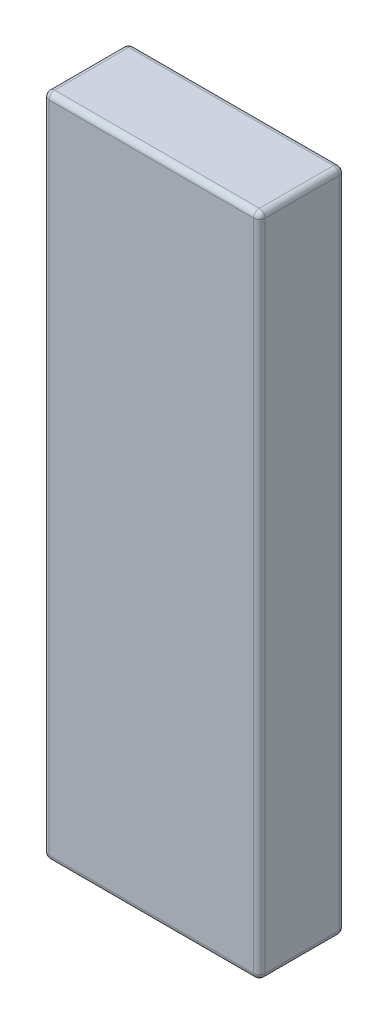
ISO-10303-21;
HEADER;
FILE_DESCRIPTION(('STEP AP214'),'2;1');
FILE_NAME('part.step','',(''),(''),'','','');
FILE_SCHEMA(('AUTOMOTIVE_DESIGN { 1 0 10303 214 1 1 1 1 }'));
ENDSEC;
DATA;
#1=APPLICATION_CONTEXT('core data for automotive mechanical design processes');
#2=APPLICATION_PROTOCOL_DEFINITION('international standard','automotive_design',2000,#1);
#3=PRODUCT_CONTEXT('',#1,'mechanical');
#4=PRODUCT('Part','Part','',(#3));
#5=PRODUCT_RELATED_PRODUCT_CATEGORY('part','',(#4));
#6=PRODUCT_DEFINITION_FORMATION('','',#4);
#7=PRODUCT_DEFINITION_CONTEXT('part definition',#1,'design');
#8=PRODUCT_DEFINITION('design','',#6,#7);
#9=PRODUCT_DEFINITION_SHAPE('','',#8);
#10=(LENGTH_UNIT() NAMED_UNIT(*) SI_UNIT(.MILLI.,.METRE.));
#11=(NAMED_UNIT(*) PLANE_ANGLE_UNIT() SI_UNIT($,.RADIAN.));
#12=(NAMED_UNIT(*) SI_UNIT($,.STERADIAN.) SOLID_ANGLE_UNIT());
#13=UNCERTAINTY_MEASURE_WITH_UNIT(LENGTH_MEASURE(1.E-05),#10,'distance_accuracy_value','');
#14=(GEOMETRIC_REPRESENTATION_CONTEXT(3) GLOBAL_UNCERTAINTY_ASSIGNED_CONTEXT((#13)) GLOBAL_UNIT_ASSIGNED_CONTEXT((#10,
#11,#12)) REPRESENTATION_CONTEXT('',''));
#15=CARTESIAN_POINT('',(0.,0.,0.));
#16=DIRECTION('',(0.,0.,1.));
#17=DIRECTION('',(1.,0.,0.));
#18=AXIS2_PLACEMENT_3D('',#15,#16,#17);
#19=CARTESIAN_POINT('',(1.9,5.85,1.5));
#20=DIRECTION('',(-1.,0.,0.));
#21=DIRECTION('',(0.,-1.,0.));
#22=AXIS2_PLACEMENT_3D('',#19,#20,#21);
#23=PLANE('',#22);
#24=DIRECTION('',(0.,0.,-1.));
#25=VECTOR('',#24,1.);
#26=CARTESIAN_POINT('',(1.9,-5.75,1.5));
#27=LINE('',#26,#25);
#28=CARTESIAN_POINT('',(1.9,-5.75,1.4));
#29=VERTEX_POINT('',#28);
#30=CARTESIAN_POINT('',(1.9,-5.75,0.1));
#31=VERTEX_POINT('',#30);
#32=EDGE_CURVE('E152',#29,#31,#27,.T.);
#33=ORIENTED_EDGE('',*,*,#32,.T.);
#34=DIRECTION('',(0.,1.,0.));
#35=VECTOR('',#34,1.);
#36=CARTESIAN_POINT('',(1.9,5.85,0.1));
#37=LINE('',#36,#35);
#38=CARTESIAN_POINT('',(1.9,5.75,0.1));
#39=VERTEX_POINT('',#38);
#40=EDGE_CURVE('E216',#31,#39,#37,.T.);
#41=ORIENTED_EDGE('',*,*,#40,.T.);
#42=DIRECTION('',(0.,0.,-1.));
#43=VECTOR('',#42,1.);
#44=CARTESIAN_POINT('',(1.9,5.75,1.5));
#45=LINE('',#44,#43);
#46=CARTESIAN_POINT('',(1.9,5.75,1.4));
#47=VERTEX_POINT('',#46);
#48=EDGE_CURVE('E211',#39,#47,#45,.F.);
#49=ORIENTED_EDGE('',*,*,#48,.T.);
#50=DIRECTION('',(0.,1.,0.));
#51=VECTOR('',#50,1.);
#52=CARTESIAN_POINT('',(1.9,-5.85,1.4));
#53=LINE('',#52,#51);
#54=EDGE_CURVE('E208',#47,#29,#53,.F.);
#55=ORIENTED_EDGE('',*,*,#54,.T.);
#56=EDGE_LOOP('',(#33,#41,#49,#55));
#57=FACE_BOUND('',#56,.T.);
#58=ADVANCED_FACE('F42',(#57),#23,.F.);
#59=CARTESIAN_POINT('',(-1.9,5.85,1.5));
#60=DIRECTION('',(0.,-1.,0.));
#61=DIRECTION('',(0.,0.,-1.));
#62=AXIS2_PLACEMENT_3D('',#59,#60,#61);
#63=PLANE('',#62);
#64=DIRECTION('',(0.,0.,-1.));
#65=VECTOR('',#64,1.);
#66=CARTESIAN_POINT('',(1.8,5.85,1.5));
#67=LINE('',#66,#65);
#68=CARTESIAN_POINT('',(1.8,5.85,1.4));
#69=VERTEX_POINT('',#68);
#70=CARTESIAN_POINT('',(1.8,5.85,0.1));
#71=VERTEX_POINT('',#70);
#72=EDGE_CURVE('E198',#69,#71,#67,.T.);
#73=ORIENTED_EDGE('',*,*,#72,.T.);
#74=DIRECTION('',(-1.,0.,0.));
#75=VECTOR('',#74,1.);
#76=CARTESIAN_POINT('',(-1.9,5.85,0.1));
#77=LINE('',#76,#75);
#78=CARTESIAN_POINT('',(-1.8,5.85,0.1));
#79=VERTEX_POINT('',#78);
#80=EDGE_CURVE('E205',#71,#79,#77,.T.);
#81=ORIENTED_EDGE('',*,*,#80,.T.);
#82=DIRECTION('',(0.,0.,-1.));
#83=VECTOR('',#82,1.);
#84=CARTESIAN_POINT('',(-1.8,5.85,1.5));
#85=LINE('',#84,#83);
#86=CARTESIAN_POINT('',(-1.8,5.85,1.4));
#87=VERTEX_POINT('',#86);
#88=EDGE_CURVE('E201',#79,#87,#85,.F.);
#89=ORIENTED_EDGE('',*,*,#88,.T.);
#90=DIRECTION('',(-1.,0.,0.));
#91=VECTOR('',#90,1.);
#92=CARTESIAN_POINT('',(1.9,5.85,1.4));
#93=LINE('',#92,#91);
#94=EDGE_CURVE('E195',#87,#69,#93,.F.);
#95=ORIENTED_EDGE('',*,*,#94,.T.);
#96=EDGE_LOOP('',(#73,#81,#89,#95));
#97=FACE_BOUND('',#96,.T.);
#98=ADVANCED_FACE('F350',(#97),#63,.F.);
#99=CARTESIAN_POINT('',(-1.9,5.85,1.5));
#100=DIRECTION('',(1.,0.,0.));
#101=DIRECTION('',(0.,1.,0.));
#102=AXIS2_PLACEMENT_3D('',#99,#100,#101);
#103=PLANE('',#102);
#104=DIRECTION('',(0.,0.,-1.));
#105=VECTOR('',#104,1.);
#106=CARTESIAN_POINT('',(-1.9,5.75,1.5));
#107=LINE('',#106,#105);
#108=CARTESIAN_POINT('',(-1.9,5.75,1.4));
#109=VERTEX_POINT('',#108);
#110=CARTESIAN_POINT('',(-1.9,5.75,0.1));
#111=VERTEX_POINT('',#110);
#112=EDGE_CURVE('E185',#109,#111,#107,.T.);
#113=ORIENTED_EDGE('',*,*,#112,.T.);
#114=DIRECTION('',(0.,-1.,0.));
#115=VECTOR('',#114,1.);
#116=CARTESIAN_POINT('',(-1.9,5.85,0.1));
#117=LINE('',#116,#115);
#118=CARTESIAN_POINT('',(-1.9,-5.75,0.1));
#119=VERTEX_POINT('',#118);
#120=EDGE_CURVE('E192',#111,#119,#117,.T.);
#121=ORIENTED_EDGE('',*,*,#120,.T.);
#122=DIRECTION('',(0.,0.,-1.));
#123=VECTOR('',#122,1.);
#124=CARTESIAN_POINT('',(-1.9,-5.75,1.5));
#125=LINE('',#124,#123);
#126=CARTESIAN_POINT('',(-1.9,-5.75,1.4));
#127=VERTEX_POINT('',#126);
#128=EDGE_CURVE('E188',#119,#127,#125,.F.);
#129=ORIENTED_EDGE('',*,*,#128,.T.);
#130=DIRECTION('',(0.,-1.,0.));
#131=VECTOR('',#130,1.);
#132=CARTESIAN_POINT('',(-1.9,5.85,1.4));
#133=LINE('',#132,#131);
#134=EDGE_CURVE('E182',#127,#109,#133,.F.);
#135=ORIENTED_EDGE('',*,*,#134,.T.);
#136=EDGE_LOOP('',(#113,#121,#129,#135));
#137=FACE_BOUND('',#136,.T.);
#138=ADVANCED_FACE('F341',(#137),#103,.F.);
#139=CARTESIAN_POINT('',(-1.9,-5.85,1.5));
#140=DIRECTION('',(0.,1.,0.));
#141=DIRECTION('',(0.,0.,1.));
#142=AXIS2_PLACEMENT_3D('',#139,#140,#141);
#143=PLANE('',#142);
#144=DIRECTION('',(0.,0.,-1.));
#145=VECTOR('',#144,1.);
#146=CARTESIAN_POINT('',(-1.8,-5.85,1.5));
#147=LINE('',#146,#145);
#148=CARTESIAN_POINT('',(-1.8,-5.85,1.4));
#149=VERTEX_POINT('',#148);
#150=CARTESIAN_POINT('',(-1.8,-5.85,0.1));
#151=VERTEX_POINT('',#150);
#152=EDGE_CURVE('E144',#149,#151,#147,.T.);
#153=ORIENTED_EDGE('',*,*,#152,.T.);
#154=DIRECTION('',(1.,0.,0.));
#155=VECTOR('',#154,1.);
#156=CARTESIAN_POINT('',(-1.9,-5.85,0.1));
#157=LINE('',#156,#155);
#158=CARTESIAN_POINT('',(1.8,-5.85,0.1));
#159=VERTEX_POINT('',#158);
#160=EDGE_CURVE('E139',#151,#159,#157,.T.);
#161=ORIENTED_EDGE('',*,*,#160,.T.);
#162=DIRECTION('',(0.,0.,-1.));
#163=VECTOR('',#162,1.);
#164=CARTESIAN_POINT('',(1.8,-5.85,1.5));
#165=LINE('',#164,#163);
#166=CARTESIAN_POINT('',(1.8,-5.85,1.4));
#167=VERTEX_POINT('',#166);
#168=EDGE_CURVE('E131',#159,#167,#165,.F.);
#169=ORIENTED_EDGE('',*,*,#168,.T.);
#170=DIRECTION('',(1.,0.,0.));
#171=VECTOR('',#170,1.);
#172=CARTESIAN_POINT('',(-1.9,-5.85,1.4));
#173=LINE('',#172,#171);
#174=EDGE_CURVE('E136',#167,#149,#173,.F.);
#175=ORIENTED_EDGE('',*,*,#174,.T.);
#176=EDGE_LOOP('',(#153,#161,#169,#175));
#177=FACE_BOUND('',#176,.T.);
#178=ADVANCED_FACE('F134',(#177),#143,.F.);
#179=CARTESIAN_POINT('',(0.,0.,1.5));
#180=DIRECTION('',(0.,0.,1.));
#181=DIRECTION('',(1.,0.,0.));
#182=AXIS2_PLACEMENT_3D('',#179,#180,#181);
#183=PLANE('',#182);
#184=DIRECTION('',(0.,-1.,0.));
#185=VECTOR('',#184,1.);
#186=CARTESIAN_POINT('',(-1.8,-5.85,1.5));
#187=LINE('',#186,#185);
#188=CARTESIAN_POINT('',(-1.8,5.75,1.5));
#189=VERTEX_POINT('',#188);
#190=CARTESIAN_POINT('',(-1.8,-5.75,1.5));
#191=VERTEX_POINT('',#190);
#192=EDGE_CURVE('E52',#189,#191,#187,.T.);
#193=ORIENTED_EDGE('',*,*,#192,.T.);
#194=DIRECTION('',(1.,0.,0.));
#195=VECTOR('',#194,1.);
#196=CARTESIAN_POINT('',(1.9,-5.75,1.5));
#197=LINE('',#196,#195);
#198=CARTESIAN_POINT('',(1.8,-5.75,1.5));
#199=VERTEX_POINT('',#198);
#200=EDGE_CURVE('E11',#191,#199,#197,.T.);
#201=ORIENTED_EDGE('',*,*,#200,.T.);
#202=DIRECTION('',(0.,1.,0.));
#203=VECTOR('',#202,1.);
#204=CARTESIAN_POINT('',(1.8,5.85,1.5));
#205=LINE('',#204,#203);
#206=CARTESIAN_POINT('',(1.8,5.75,1.5));
#207=VERTEX_POINT('',#206);
#208=EDGE_CURVE('E232',#199,#207,#205,.T.);
#209=ORIENTED_EDGE('',*,*,#208,.T.);
#210=DIRECTION('',(-1.,0.,0.));
#211=VECTOR('',#210,1.);
#212=CARTESIAN_POINT('',(-1.9,5.75,1.5));
#213=LINE('',#212,#211);
#214=EDGE_CURVE('E63',#207,#189,#213,.T.);
#215=ORIENTED_EDGE('',*,*,#214,.T.);
#216=EDGE_LOOP('',(#193,#201,#209,#215));
#217=FACE_BOUND('',#216,.T.);
#218=ADVANCED_FACE('F581',(#217),#183,.T.);
#219=CARTESIAN_POINT('',(0.,0.,0.));
#220=DIRECTION('',(0.,0.,1.));
#221=DIRECTION('',(1.,0.,0.));
#222=AXIS2_PLACEMENT_3D('',#219,#220,#221);
#223=PLANE('',#222);
#224=DIRECTION('',(0.,-1.,0.));
#225=VECTOR('',#224,1.);
#226=CARTESIAN_POINT('',(-1.8,0.,0.));
#227=LINE('',#226,#225);
#228=CARTESIAN_POINT('',(-1.8,-5.75,0.));
#229=VERTEX_POINT('',#228);
#230=CARTESIAN_POINT('',(-1.8,5.75,0.));
#231=VERTEX_POINT('',#230);
#232=EDGE_CURVE('E225',#229,#231,#227,.F.);
#233=ORIENTED_EDGE('',*,*,#232,.T.);
#234=DIRECTION('',(-1.,0.,0.));
#235=VECTOR('',#234,1.);
#236=CARTESIAN_POINT('',(0.,5.75,0.));
#237=LINE('',#236,#235);
#238=CARTESIAN_POINT('',(1.8,5.75,0.));
#239=VERTEX_POINT('',#238);
#240=EDGE_CURVE('E228',#231,#239,#237,.F.);
#241=ORIENTED_EDGE('',*,*,#240,.T.);
#242=DIRECTION('',(0.,1.,0.));
#243=VECTOR('',#242,1.);
#244=CARTESIAN_POINT('',(1.8,0.,0.));
#245=LINE('',#244,#243);
#246=CARTESIAN_POINT('',(1.8,-5.75,0.));
#247=VERTEX_POINT('',#246);
#248=EDGE_CURVE('E219',#239,#247,#245,.F.);
#249=ORIENTED_EDGE('',*,*,#248,.T.);
#250=DIRECTION('',(1.,0.,0.));
#251=VECTOR('',#250,1.);
#252=CARTESIAN_POINT('',(0.,-5.75,0.));
#253=LINE('',#252,#251);
#254=EDGE_CURVE('E222',#247,#229,#253,.F.);
#255=ORIENTED_EDGE('',*,*,#254,.T.);
#256=EDGE_LOOP('',(#233,#241,#249,#255));
#257=FACE_BOUND('',#256,.T.);
#258=ADVANCED_FACE('F323',(#257),#223,.F.);
#259=CARTESIAN_POINT('',(1.8,5.75,1.5));
#260=DIRECTION('',(0.,0.,-1.));
#261=DIRECTION('',(-1.,0.,0.));
#262=AXIS2_PLACEMENT_3D('',#259,#260,#261);
#263=CYLINDRICAL_SURFACE('',#262,0.1);
#264=CARTESIAN_POINT('',(1.8,5.75,1.4));
#265=DIRECTION('',(0.,0.,1.));
#266=DIRECTION('',(1.,0.,0.));
#267=AXIS2_PLACEMENT_3D('',#264,#265,#266);
#268=CIRCLE('',#267,0.1);
#269=EDGE_CURVE('E46',#47,#69,#268,.T.);
#270=ORIENTED_EDGE('',*,*,#269,.F.);
#271=ORIENTED_EDGE('',*,*,#48,.F.);
#272=CARTESIAN_POINT('',(1.8,5.75,0.1));
#273=DIRECTION('',(0.,0.,-1.));
#274=DIRECTION('',(-1.,0.,0.));
#275=AXIS2_PLACEMENT_3D('',#272,#273,#274);
#276=CIRCLE('',#275,0.1);
#277=EDGE_CURVE('E176',#71,#39,#276,.T.);
#278=ORIENTED_EDGE('',*,*,#277,.F.);
#279=ORIENTED_EDGE('',*,*,#72,.F.);
#280=EDGE_LOOP('',(#270,#271,#278,#279));
#281=FACE_BOUND('',#280,.T.);
#282=ADVANCED_FACE('F44',(#281),#263,.T.);
#283=CARTESIAN_POINT('',(1.8,5.75,1.4));
#284=DIRECTION('',(0.,1.,0.));
#285=DIRECTION('',(-1.,0.,0.));
#286=AXIS2_PLACEMENT_3D('',#283,#284,#285);
#287=SPHERICAL_SURFACE('',#286,0.1);
#288=CARTESIAN_POINT('',(1.8,5.75,1.4));
#289=DIRECTION('',(0.,1.,0.));
#290=DIRECTION('',(0.,0.,1.));
#291=AXIS2_PLACEMENT_3D('',#288,#289,#290);
#292=CIRCLE('',#291,0.1);
#293=EDGE_CURVE('E299',#47,#207,#292,.F.);
#294=ORIENTED_EDGE('',*,*,#293,.F.);
#295=ORIENTED_EDGE('',*,*,#269,.T.);
#296=CARTESIAN_POINT('',(1.8,5.75,1.4));
#297=DIRECTION('',(1.,0.,0.));
#298=DIRECTION('',(0.,0.,-1.));
#299=AXIS2_PLACEMENT_3D('',#296,#297,#298);
#300=CIRCLE('',#299,0.1);
#301=EDGE_CURVE('E303',#207,#69,#300,.F.);
#302=ORIENTED_EDGE('',*,*,#301,.F.);
#303=EDGE_LOOP('',(#294,#295,#302));
#304=FACE_BOUND('',#303,.T.);
#305=ADVANCED_FACE('F355',(#304),#287,.T.);
#306=CARTESIAN_POINT('',(1.8,5.75,0.1));
#307=DIRECTION('',(1.,0.,0.));
#308=DIRECTION('',(0.,0.,-1.));
#309=AXIS2_PLACEMENT_3D('',#306,#307,#308);
#310=SPHERICAL_SURFACE('',#309,0.1);
#311=CARTESIAN_POINT('',(1.8,5.75,0.1));
#312=DIRECTION('',(1.,0.,0.));
#313=DIRECTION('',(0.,1.,0.));
#314=AXIS2_PLACEMENT_3D('',#311,#312,#313);
#315=CIRCLE('',#314,0.1);
#316=EDGE_CURVE('E291',#71,#239,#315,.F.);
#317=ORIENTED_EDGE('',*,*,#316,.F.);
#318=ORIENTED_EDGE('',*,*,#277,.T.);
#319=CARTESIAN_POINT('',(1.8,5.75,0.1));
#320=DIRECTION('',(0.,1.,0.));
#321=DIRECTION('',(0.,0.,1.));
#322=AXIS2_PLACEMENT_3D('',#319,#320,#321);
#323=CIRCLE('',#322,0.1);
#324=EDGE_CURVE('E295',#239,#39,#323,.F.);
#325=ORIENTED_EDGE('',*,*,#324,.F.);
#326=EDGE_LOOP('',(#317,#318,#325));
#327=FACE_BOUND('',#326,.T.);
#328=ADVANCED_FACE('F312',(#327),#310,.T.);
#329=CARTESIAN_POINT('',(0.,5.75,1.4));
#330=DIRECTION('',(1.,0.,0.));
#331=DIRECTION('',(0.,0.,-1.));
#332=AXIS2_PLACEMENT_3D('',#329,#330,#331);
#333=CYLINDRICAL_SURFACE('',#332,0.1);
#334=ORIENTED_EDGE('',*,*,#301,.T.);
#335=ORIENTED_EDGE('',*,*,#94,.F.);
#336=CARTESIAN_POINT('',(-1.8,5.75,1.4));
#337=DIRECTION('',(-1.,0.,0.));
#338=DIRECTION('',(0.,0.,1.));
#339=AXIS2_PLACEMENT_3D('',#336,#337,#338);
#340=CIRCLE('',#339,0.1);
#341=EDGE_CURVE('E284',#189,#87,#340,.T.);
#342=ORIENTED_EDGE('',*,*,#341,.F.);
#343=ORIENTED_EDGE('',*,*,#214,.F.);
#344=EDGE_LOOP('',(#334,#335,#342,#343));
#345=FACE_BOUND('',#344,.T.);
#346=ADVANCED_FACE('F358',(#345),#333,.T.);
#347=CARTESIAN_POINT('',(1.8,0.,1.4));
#348=DIRECTION('',(0.,-1.,0.));
#349=DIRECTION('',(1.,0.,0.));
#350=AXIS2_PLACEMENT_3D('',#347,#348,#349);
#351=CYLINDRICAL_SURFACE('',#350,0.1);
#352=ORIENTED_EDGE('',*,*,#293,.T.);
#353=ORIENTED_EDGE('',*,*,#208,.F.);
#354=CARTESIAN_POINT('',(1.8,-5.75,1.4));
#355=DIRECTION('',(0.,-1.,0.));
#356=DIRECTION('',(0.,0.,-1.));
#357=AXIS2_PLACEMENT_3D('',#354,#355,#356);
#358=CIRCLE('',#357,0.1);
#359=EDGE_CURVE('E157',#29,#199,#358,.T.);
#360=ORIENTED_EDGE('',*,*,#359,.F.);
#361=ORIENTED_EDGE('',*,*,#54,.F.);
#362=EDGE_LOOP('',(#352,#353,#360,#361));
#363=FACE_BOUND('',#362,.T.);
#364=ADVANCED_FACE('F527',(#363),#351,.T.);
#365=CARTESIAN_POINT('',(1.8,-5.75,1.5));
#366=DIRECTION('',(0.,0.,-1.));
#367=DIRECTION('',(-1.,0.,0.));
#368=AXIS2_PLACEMENT_3D('',#365,#366,#367);
#369=CYLINDRICAL_SURFACE('',#368,0.1);
#370=CARTESIAN_POINT('',(1.8,-5.75,0.1));
#371=DIRECTION('',(0.,0.,-1.));
#372=DIRECTION('',(-1.,0.,0.));
#373=AXIS2_PLACEMENT_3D('',#370,#371,#372);
#374=CIRCLE('',#373,0.1);
#375=EDGE_CURVE('E158',#31,#159,#374,.T.);
#376=ORIENTED_EDGE('',*,*,#375,.F.);
#377=ORIENTED_EDGE('',*,*,#32,.F.);
#378=CARTESIAN_POINT('',(1.8,-5.75,1.4));
#379=DIRECTION('',(0.,0.,1.));
#380=DIRECTION('',(1.,0.,0.));
#381=AXIS2_PLACEMENT_3D('',#378,#379,#380);
#382=CIRCLE('',#381,0.1);
#383=EDGE_CURVE('E148',#167,#29,#382,.T.);
#384=ORIENTED_EDGE('',*,*,#383,.F.);
#385=ORIENTED_EDGE('',*,*,#168,.F.);
#386=EDGE_LOOP('',(#376,#377,#384,#385));
#387=FACE_BOUND('',#386,.T.);
#388=ADVANCED_FACE('F150',(#387),#369,.T.);
#389=CARTESIAN_POINT('',(1.8,5.85,0.1));
#390=DIRECTION('',(0.,1.,0.));
#391=DIRECTION('',(-1.,0.,0.));
#392=AXIS2_PLACEMENT_3D('',#389,#390,#391);
#393=CYLINDRICAL_SURFACE('',#392,0.1);
#394=ORIENTED_EDGE('',*,*,#324,.T.);
#395=ORIENTED_EDGE('',*,*,#40,.F.);
#396=CARTESIAN_POINT('',(1.8,-5.75,0.1));
#397=DIRECTION('',(0.,-1.,0.));
#398=DIRECTION('',(1.,0.,0.));
#399=AXIS2_PLACEMENT_3D('',#396,#397,#398);
#400=CIRCLE('',#399,0.1);
#401=EDGE_CURVE('E277',#247,#31,#400,.T.);
#402=ORIENTED_EDGE('',*,*,#401,.F.);
#403=ORIENTED_EDGE('',*,*,#248,.F.);
#404=EDGE_LOOP('',(#394,#395,#402,#403));
#405=FACE_BOUND('',#404,.T.);
#406=ADVANCED_FACE('F319',(#405),#393,.T.);
#407=CARTESIAN_POINT('',(-1.9,5.75,0.1));
#408=DIRECTION('',(-1.,0.,0.));
#409=DIRECTION('',(0.,0.,1.));
#410=AXIS2_PLACEMENT_3D('',#407,#408,#409);
#411=CYLINDRICAL_SURFACE('',#410,0.1);
#412=ORIENTED_EDGE('',*,*,#316,.T.);
#413=ORIENTED_EDGE('',*,*,#240,.F.);
#414=CARTESIAN_POINT('',(-1.8,5.75,0.1));
#415=DIRECTION('',(-1.,0.,0.));
#416=DIRECTION('',(0.,0.,1.));
#417=AXIS2_PLACEMENT_3D('',#414,#415,#416);
#418=CIRCLE('',#417,0.1);
#419=EDGE_CURVE('E273',#79,#231,#418,.T.);
#420=ORIENTED_EDGE('',*,*,#419,.F.);
#421=ORIENTED_EDGE('',*,*,#80,.F.);
#422=EDGE_LOOP('',(#412,#413,#420,#421));
#423=FACE_BOUND('',#422,.T.);
#424=ADVANCED_FACE('F329',(#423),#411,.T.);
#425=CARTESIAN_POINT('',(-1.8,5.75,1.5));
#426=DIRECTION('',(0.,0.,-1.));
#427=DIRECTION('',(-1.,0.,0.));
#428=AXIS2_PLACEMENT_3D('',#425,#426,#427);
#429=CYLINDRICAL_SURFACE('',#428,0.1);
#430=CARTESIAN_POINT('',(-1.8,5.75,1.4));
#431=DIRECTION('',(0.,0.,1.));
#432=DIRECTION('',(1.,0.,0.));
#433=AXIS2_PLACEMENT_3D('',#430,#431,#432);
#434=CIRCLE('',#433,0.1);
#435=EDGE_CURVE('E287',#87,#109,#434,.T.);
#436=ORIENTED_EDGE('',*,*,#435,.F.);
#437=ORIENTED_EDGE('',*,*,#88,.F.);
#438=CARTESIAN_POINT('',(-1.8,5.75,0.1));
#439=DIRECTION('',(0.,0.,-1.));
#440=DIRECTION('',(-1.,0.,0.));
#441=AXIS2_PLACEMENT_3D('',#438,#439,#440);
#442=CIRCLE('',#441,0.1);
#443=EDGE_CURVE('E269',#111,#79,#442,.T.);
#444=ORIENTED_EDGE('',*,*,#443,.F.);
#445=ORIENTED_EDGE('',*,*,#112,.F.);
#446=EDGE_LOOP('',(#436,#437,#444,#445));
#447=FACE_BOUND('',#446,.T.);
#448=ADVANCED_FACE('F347',(#447),#429,.T.);
#449=CARTESIAN_POINT('',(-1.8,5.75,1.4));
#450=DIRECTION('',(0.,1.,0.));
#451=DIRECTION('',(0.,0.,1.));
#452=AXIS2_PLACEMENT_3D('',#449,#450,#451);
#453=SPHERICAL_SURFACE('',#452,0.1);
#454=ORIENTED_EDGE('',*,*,#341,.T.);
#455=ORIENTED_EDGE('',*,*,#435,.T.);
#456=CARTESIAN_POINT('',(-1.8,5.75,1.4));
#457=DIRECTION('',(0.,1.,0.));
#458=DIRECTION('',(0.,0.,1.));
#459=AXIS2_PLACEMENT_3D('',#456,#457,#458);
#460=CIRCLE('',#459,0.1);
#461=EDGE_CURVE('E165',#189,#109,#460,.F.);
#462=ORIENTED_EDGE('',*,*,#461,.F.);
#463=EDGE_LOOP('',(#454,#455,#462));
#464=FACE_BOUND('',#463,.T.);
#465=ADVANCED_FACE('F361',(#464),#453,.T.);
#466=CARTESIAN_POINT('',(1.8,-5.75,1.4));
#467=DIRECTION('',(1.,0.,0.));
#468=DIRECTION('',(0.,1.,0.));
#469=AXIS2_PLACEMENT_3D('',#466,#467,#468);
#470=SPHERICAL_SURFACE('',#469,0.1);
#471=ORIENTED_EDGE('',*,*,#383,.T.);
#472=ORIENTED_EDGE('',*,*,#359,.T.);
#473=CARTESIAN_POINT('',(1.8,-5.75,1.4));
#474=DIRECTION('',(1.,0.,0.));
#475=DIRECTION('',(0.,0.,-1.));
#476=AXIS2_PLACEMENT_3D('',#473,#474,#475);
#477=CIRCLE('',#476,0.1);
#478=EDGE_CURVE('E160',#167,#199,#477,.F.);
#479=ORIENTED_EDGE('',*,*,#478,.F.);
#480=EDGE_LOOP('',(#471,#472,#479));
#481=FACE_BOUND('',#480,.T.);
#482=ADVANCED_FACE('F161',(#481),#470,.T.);
#483=CARTESIAN_POINT('',(1.8,-5.75,0.1));
#484=DIRECTION('',(1.,0.,0.));
#485=DIRECTION('',(0.,1.,0.));
#486=AXIS2_PLACEMENT_3D('',#483,#484,#485);
#487=SPHERICAL_SURFACE('',#486,0.1);
#488=ORIENTED_EDGE('',*,*,#401,.T.);
#489=ORIENTED_EDGE('',*,*,#375,.T.);
#490=CARTESIAN_POINT('',(1.8,-5.75,0.1));
#491=DIRECTION('',(1.,0.,0.));
#492=DIRECTION('',(0.,0.,-1.));
#493=AXIS2_PLACEMENT_3D('',#490,#491,#492);
#494=CIRCLE('',#493,0.1);
#495=EDGE_CURVE('E166',#247,#159,#494,.F.);
#496=ORIENTED_EDGE('',*,*,#495,.F.);
#497=EDGE_LOOP('',(#488,#489,#496));
#498=FACE_BOUND('',#497,.T.);
#499=ADVANCED_FACE('F376',(#498),#487,.T.);
#500=CARTESIAN_POINT('',(-1.8,5.75,0.1));
#501=DIRECTION('',(0.,1.,0.));
#502=DIRECTION('',(0.,0.,1.));
#503=AXIS2_PLACEMENT_3D('',#500,#501,#502);
#504=SPHERICAL_SURFACE('',#503,0.1);
#505=ORIENTED_EDGE('',*,*,#443,.T.);
#506=ORIENTED_EDGE('',*,*,#419,.T.);
#507=CARTESIAN_POINT('',(-1.8,5.75,0.1));
#508=DIRECTION('',(0.,1.,0.));
#509=DIRECTION('',(0.,0.,1.));
#510=AXIS2_PLACEMENT_3D('',#507,#508,#509);
#511=CIRCLE('',#510,0.1);
#512=EDGE_CURVE('E259',#111,#231,#511,.F.);
#513=ORIENTED_EDGE('',*,*,#512,.F.);
#514=EDGE_LOOP('',(#505,#506,#513));
#515=FACE_BOUND('',#514,.T.);
#516=ADVANCED_FACE('F332',(#515),#504,.T.);
#517=CARTESIAN_POINT('',(-1.8,0.,1.4));
#518=DIRECTION('',(0.,1.,0.));
#519=DIRECTION('',(-1.,0.,0.));
#520=AXIS2_PLACEMENT_3D('',#517,#518,#519);
#521=CYLINDRICAL_SURFACE('',#520,0.1);
#522=ORIENTED_EDGE('',*,*,#461,.T.);
#523=ORIENTED_EDGE('',*,*,#134,.F.);
#524=CARTESIAN_POINT('',(-1.8,-5.75,1.4));
#525=DIRECTION('',(0.,-1.,0.));
#526=DIRECTION('',(0.,0.,-1.));
#527=AXIS2_PLACEMENT_3D('',#524,#525,#526);
#528=CIRCLE('',#527,0.1);
#529=EDGE_CURVE('E255',#191,#127,#528,.T.);
#530=ORIENTED_EDGE('',*,*,#529,.F.);
#531=ORIENTED_EDGE('',*,*,#192,.F.);
#532=EDGE_LOOP('',(#522,#523,#530,#531));
#533=FACE_BOUND('',#532,.T.);
#534=ADVANCED_FACE('F364',(#533),#521,.T.);
#535=CARTESIAN_POINT('',(0.,-5.75,1.4));
#536=DIRECTION('',(-1.,0.,0.));
#537=DIRECTION('',(0.,0.,1.));
#538=AXIS2_PLACEMENT_3D('',#535,#536,#537);
#539=CYLINDRICAL_SURFACE('',#538,0.1);
#540=ORIENTED_EDGE('',*,*,#478,.T.);
#541=ORIENTED_EDGE('',*,*,#200,.F.);
#542=CARTESIAN_POINT('',(-1.8,-5.75,1.4));
#543=DIRECTION('',(-1.,0.,0.));
#544=DIRECTION('',(0.,0.,1.));
#545=AXIS2_PLACEMENT_3D('',#542,#543,#544);
#546=CIRCLE('',#545,0.1);
#547=EDGE_CURVE('E170',#149,#191,#546,.T.);
#548=ORIENTED_EDGE('',*,*,#547,.F.);
#549=ORIENTED_EDGE('',*,*,#174,.F.);
#550=EDGE_LOOP('',(#540,#541,#548,#549));
#551=FACE_BOUND('',#550,.T.);
#552=ADVANCED_FACE('F168',(#551),#539,.T.);
#553=CARTESIAN_POINT('',(-1.9,-5.75,0.1));
#554=DIRECTION('',(1.,0.,0.));
#555=DIRECTION('',(0.,0.,-1.));
#556=AXIS2_PLACEMENT_3D('',#553,#554,#555);
#557=CYLINDRICAL_SURFACE('',#556,0.1);
#558=ORIENTED_EDGE('',*,*,#495,.T.);
#559=ORIENTED_EDGE('',*,*,#160,.F.);
#560=CARTESIAN_POINT('',(-1.8,-5.75,0.1));
#561=DIRECTION('',(-1.,0.,0.));
#562=DIRECTION('',(0.,0.,1.));
#563=AXIS2_PLACEMENT_3D('',#560,#561,#562);
#564=CIRCLE('',#563,0.1);
#565=EDGE_CURVE('E249',#229,#151,#564,.T.);
#566=ORIENTED_EDGE('',*,*,#565,.F.);
#567=ORIENTED_EDGE('',*,*,#254,.F.);
#568=EDGE_LOOP('',(#558,#559,#566,#567));
#569=FACE_BOUND('',#568,.T.);
#570=ADVANCED_FACE('F374',(#569),#557,.T.);
#571=CARTESIAN_POINT('',(-1.8,5.85,0.1));
#572=DIRECTION('',(0.,-1.,0.));
#573=DIRECTION('',(1.,0.,0.));
#574=AXIS2_PLACEMENT_3D('',#571,#572,#573);
#575=CYLINDRICAL_SURFACE('',#574,0.1);
#576=ORIENTED_EDGE('',*,*,#512,.T.);
#577=ORIENTED_EDGE('',*,*,#232,.F.);
#578=CARTESIAN_POINT('',(-1.8,-5.75,0.1));
#579=DIRECTION('',(0.,-1.,0.));
#580=DIRECTION('',(0.,0.,-1.));
#581=AXIS2_PLACEMENT_3D('',#578,#579,#580);
#582=CIRCLE('',#581,0.1);
#583=EDGE_CURVE('E245',#119,#229,#582,.T.);
#584=ORIENTED_EDGE('',*,*,#583,.F.);
#585=ORIENTED_EDGE('',*,*,#120,.F.);
#586=EDGE_LOOP('',(#576,#577,#584,#585));
#587=FACE_BOUND('',#586,.T.);
#588=ADVANCED_FACE('F336',(#587),#575,.T.);
#589=CARTESIAN_POINT('',(-1.8,-5.75,1.4));
#590=DIRECTION('',(0.,0.,1.));
#591=DIRECTION('',(1.,0.,0.));
#592=AXIS2_PLACEMENT_3D('',#589,#590,#591);
#593=SPHERICAL_SURFACE('',#592,0.1);
#594=ORIENTED_EDGE('',*,*,#547,.T.);
#595=ORIENTED_EDGE('',*,*,#529,.T.);
#596=CARTESIAN_POINT('',(-1.8,-5.75,1.4));
#597=DIRECTION('',(0.,0.,1.));
#598=DIRECTION('',(1.,0.,0.));
#599=AXIS2_PLACEMENT_3D('',#596,#597,#598);
#600=CIRCLE('',#599,0.1);
#601=EDGE_CURVE('E242',#149,#127,#600,.F.);
#602=ORIENTED_EDGE('',*,*,#601,.F.);
#603=EDGE_LOOP('',(#594,#595,#602));
#604=FACE_BOUND('',#603,.T.);
#605=ADVANCED_FACE('F366',(#604),#593,.T.);
#606=CARTESIAN_POINT('',(-1.8,-5.75,0.1));
#607=DIRECTION('',(0.,0.,-1.));
#608=DIRECTION('',(-1.,0.,0.));
#609=AXIS2_PLACEMENT_3D('',#606,#607,#608);
#610=SPHERICAL_SURFACE('',#609,0.1);
#611=ORIENTED_EDGE('',*,*,#583,.T.);
#612=ORIENTED_EDGE('',*,*,#565,.T.);
#613=CARTESIAN_POINT('',(-1.8,-5.75,0.1));
#614=DIRECTION('',(0.,0.,-1.));
#615=DIRECTION('',(-1.,0.,0.));
#616=AXIS2_PLACEMENT_3D('',#613,#614,#615);
#617=CIRCLE('',#616,0.1);
#618=EDGE_CURVE('E239',#119,#151,#617,.F.);
#619=ORIENTED_EDGE('',*,*,#618,.F.);
#620=EDGE_LOOP('',(#611,#612,#619));
#621=FACE_BOUND('',#620,.T.);
#622=ADVANCED_FACE('F372',(#621),#610,.T.);
#623=CARTESIAN_POINT('',(-1.8,-5.75,1.5));
#624=DIRECTION('',(0.,0.,-1.));
#625=DIRECTION('',(-1.,0.,0.));
#626=AXIS2_PLACEMENT_3D('',#623,#624,#625);
#627=CYLINDRICAL_SURFACE('',#626,0.1);
#628=ORIENTED_EDGE('',*,*,#601,.T.);
#629=ORIENTED_EDGE('',*,*,#128,.F.);
#630=ORIENTED_EDGE('',*,*,#618,.T.);
#631=ORIENTED_EDGE('',*,*,#152,.F.);
#632=EDGE_LOOP('',(#628,#629,#630,#631));
#633=FACE_BOUND('',#632,.T.);
#634=ADVANCED_FACE('F369',(#633),#627,.T.);
#635=CLOSED_SHELL('',(#58,#98,#138,#178,#218,#258,#282,#305,#328,#346,#364,#388,#406,#424,#448,
#465,#482,#499,#516,#534,#552,#570,#588,#605,#622,#634));
#636=MANIFOLD_SOLID_BREP('B2',#635);
#637=ADVANCED_BREP_SHAPE_REPRESENTATION('',(#18,#636),#14);
#638=SHAPE_DEFINITION_REPRESENTATION(#9,#637);
ENDSEC;
END-ISO-10303-21;
